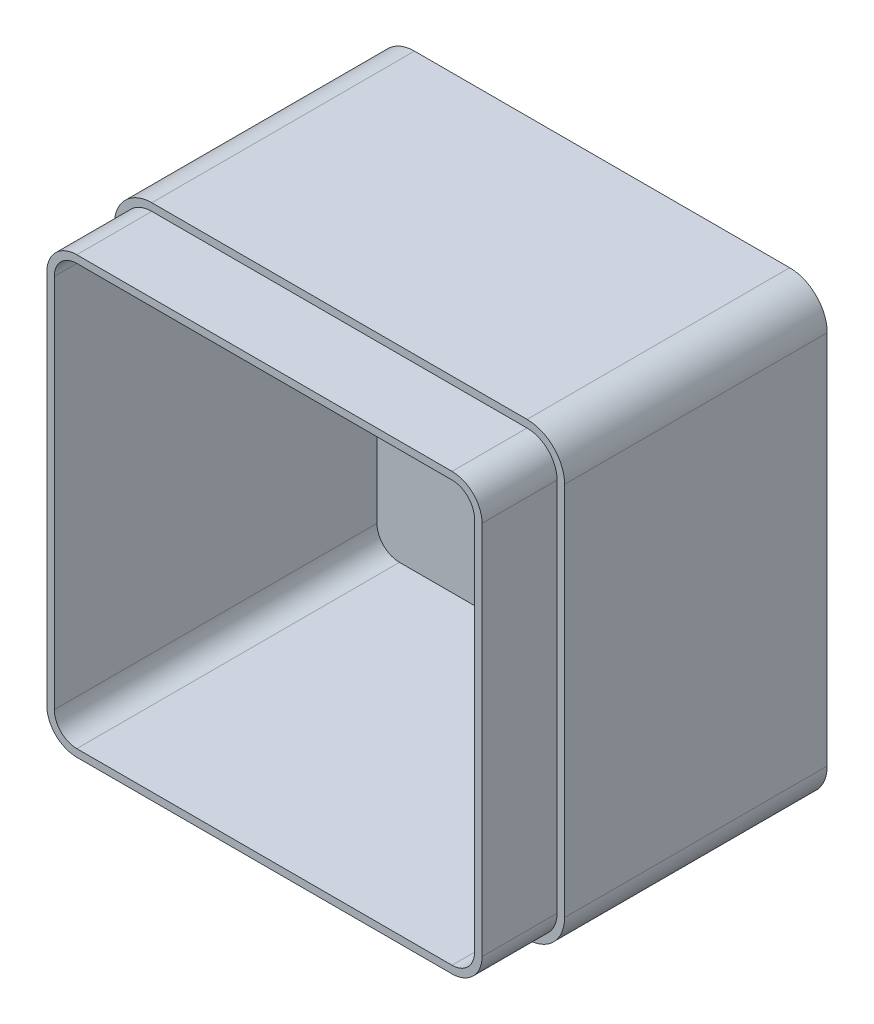
ISO-10303-21;
HEADER;
FILE_DESCRIPTION(('STEP AP214'),'2;1');
FILE_NAME('part.step','',(''),(''),'','','');
FILE_SCHEMA(('AUTOMOTIVE_DESIGN { 1 0 10303 214 1 1 1 1 }'));
ENDSEC;
DATA;
#1=APPLICATION_CONTEXT('core data for automotive mechanical design processes');
#2=APPLICATION_PROTOCOL_DEFINITION('international standard','automotive_design',2000,#1);
#3=PRODUCT_CONTEXT('',#1,'mechanical');
#4=PRODUCT('Part','Part','',(#3));
#5=PRODUCT_RELATED_PRODUCT_CATEGORY('part','',(#4));
#6=PRODUCT_DEFINITION_FORMATION('','',#4);
#7=PRODUCT_DEFINITION_CONTEXT('part definition',#1,'design');
#8=PRODUCT_DEFINITION('design','',#6,#7);
#9=PRODUCT_DEFINITION_SHAPE('','',#8);
#10=(LENGTH_UNIT() NAMED_UNIT(*) SI_UNIT(.MILLI.,.METRE.));
#11=(NAMED_UNIT(*) PLANE_ANGLE_UNIT() SI_UNIT($,.RADIAN.));
#12=(NAMED_UNIT(*) SI_UNIT($,.STERADIAN.) SOLID_ANGLE_UNIT());
#13=UNCERTAINTY_MEASURE_WITH_UNIT(LENGTH_MEASURE(1.E-05),#10,'distance_accuracy_value','');
#14=(GEOMETRIC_REPRESENTATION_CONTEXT(3) GLOBAL_UNCERTAINTY_ASSIGNED_CONTEXT((#13)) GLOBAL_UNIT_ASSIGNED_CONTEXT((#10,
#11,#12)) REPRESENTATION_CONTEXT('',''));
#15=CARTESIAN_POINT('',(0.,0.,0.));
#16=DIRECTION('',(0.,0.,1.));
#17=DIRECTION('',(1.,0.,0.));
#18=AXIS2_PLACEMENT_3D('',#15,#16,#17);
#19=CARTESIAN_POINT('',(0.,0.,90.));
#20=DIRECTION('',(0.,0.,-1.));
#21=DIRECTION('',(-1.,0.,0.));
#22=AXIS2_PLACEMENT_3D('',#19,#20,#21);
#23=PLANE('',#22);
#24=DIRECTION('',(1.,0.,0.));
#25=VECTOR('',#24,1.);
#26=CARTESIAN_POINT('',(0.,4.,90.));
#27=LINE('',#26,#25);
#28=CARTESIAN_POINT('',(9.99999999999999,4.,90.));
#29=VERTEX_POINT('',#28);
#30=CARTESIAN_POINT('',(110.,4.,90.));
#31=VERTEX_POINT('',#30);
#32=EDGE_CURVE('E384',#29,#31,#27,.T.);
#33=ORIENTED_EDGE('',*,*,#32,.F.);
#34=CARTESIAN_POINT('',(9.99999999999999,10.,90.));
#35=DIRECTION('',(0.,0.,-1.));
#36=DIRECTION('',(-1.,0.,0.));
#37=AXIS2_PLACEMENT_3D('',#34,#35,#36);
#38=CIRCLE('',#37,6.);
#39=CARTESIAN_POINT('',(4.,10.,90.));
#40=VERTEX_POINT('',#39);
#41=EDGE_CURVE('E385',#40,#29,#38,.F.);
#42=ORIENTED_EDGE('',*,*,#41,.F.);
#43=DIRECTION('',(0.,-1.,0.));
#44=VECTOR('',#43,1.);
#45=CARTESIAN_POINT('',(4.,0.,90.));
#46=LINE('',#45,#44);
#47=CARTESIAN_POINT('',(3.99999999999996,110.,90.));
#48=VERTEX_POINT('',#47);
#49=EDGE_CURVE('E358',#48,#40,#46,.T.);
#50=ORIENTED_EDGE('',*,*,#49,.F.);
#51=CARTESIAN_POINT('',(9.99999999999996,110.,90.));
#52=DIRECTION('',(0.,0.,-1.));
#53=DIRECTION('',(-1.,0.,0.));
#54=AXIS2_PLACEMENT_3D('',#51,#52,#53);
#55=CIRCLE('',#54,6.);
#56=CARTESIAN_POINT('',(9.99999999999996,116.,90.));
#57=VERTEX_POINT('',#56);
#58=EDGE_CURVE('E364',#57,#48,#55,.F.);
#59=ORIENTED_EDGE('',*,*,#58,.F.);
#60=DIRECTION('',(-1.,0.,0.));
#61=VECTOR('',#60,1.);
#62=CARTESIAN_POINT('',(0.,116.,90.));
#63=LINE('',#62,#61);
#64=CARTESIAN_POINT('',(110.,116.,90.));
#65=VERTEX_POINT('',#64);
#66=EDGE_CURVE('E374',#65,#57,#63,.T.);
#67=ORIENTED_EDGE('',*,*,#66,.F.);
#68=CARTESIAN_POINT('',(110.,110.,90.));
#69=DIRECTION('',(0.,0.,-1.));
#70=DIRECTION('',(-1.,0.,0.));
#71=AXIS2_PLACEMENT_3D('',#68,#69,#70);
#72=CIRCLE('',#71,6.);
#73=CARTESIAN_POINT('',(116.,110.,90.));
#74=VERTEX_POINT('',#73);
#75=EDGE_CURVE('E388',#74,#65,#72,.F.);
#76=ORIENTED_EDGE('',*,*,#75,.F.);
#77=DIRECTION('',(0.,1.,0.));
#78=VECTOR('',#77,1.);
#79=CARTESIAN_POINT('',(116.,0.,90.));
#80=LINE('',#79,#78);
#81=CARTESIAN_POINT('',(116.,10.,90.));
#82=VERTEX_POINT('',#81);
#83=EDGE_CURVE('E392',#82,#74,#80,.T.);
#84=ORIENTED_EDGE('',*,*,#83,.F.);
#85=CARTESIAN_POINT('',(110.,10.,90.));
#86=DIRECTION('',(0.,0.,-1.));
#87=DIRECTION('',(-1.,0.,0.));
#88=AXIS2_PLACEMENT_3D('',#85,#86,#87);
#89=CIRCLE('',#88,6.);
#90=EDGE_CURVE('E334',#31,#82,#89,.F.);
#91=ORIENTED_EDGE('',*,*,#90,.F.);
#92=EDGE_LOOP('',(#33,#42,#50,#59,#67,#76,#84,#91));
#93=FACE_BOUND('',#92,.T.);
#94=CARTESIAN_POINT('',(9.99999999999999,10.,90.));
#95=DIRECTION('',(0.,0.,1.));
#96=DIRECTION('',(1.,0.,0.));
#97=AXIS2_PLACEMENT_3D('',#94,#95,#96);
#98=CIRCLE('',#97,8.);
#99=CARTESIAN_POINT('',(2.,9.99999999999999,90.));
#100=VERTEX_POINT('',#99);
#101=CARTESIAN_POINT('',(9.99999999999999,2.,90.));
#102=VERTEX_POINT('',#101);
#103=EDGE_CURVE('E256',#100,#102,#98,.T.);
#104=ORIENTED_EDGE('',*,*,#103,.T.);
#105=DIRECTION('',(1.,0.,0.));
#106=VECTOR('',#105,1.);
#107=CARTESIAN_POINT('',(9.99999999999999,2.,90.));
#108=LINE('',#107,#106);
#109=CARTESIAN_POINT('',(110.,2.,90.));
#110=VERTEX_POINT('',#109);
#111=EDGE_CURVE('E206',#102,#110,#108,.T.);
#112=ORIENTED_EDGE('',*,*,#111,.T.);
#113=CARTESIAN_POINT('',(110.,10.,90.));
#114=DIRECTION('',(0.,0.,1.));
#115=DIRECTION('',(1.,0.,0.));
#116=AXIS2_PLACEMENT_3D('',#113,#114,#115);
#117=CIRCLE('',#116,7.99999999999999);
#118=CARTESIAN_POINT('',(118.,10.,90.));
#119=VERTEX_POINT('',#118);
#120=EDGE_CURVE('E55',#110,#119,#117,.T.);
#121=ORIENTED_EDGE('',*,*,#120,.T.);
#122=DIRECTION('',(0.,1.,0.));
#123=VECTOR('',#122,1.);
#124=CARTESIAN_POINT('',(118.,10.,90.));
#125=LINE('',#124,#123);
#126=CARTESIAN_POINT('',(118.,110.,90.));
#127=VERTEX_POINT('',#126);
#128=EDGE_CURVE('E263',#119,#127,#125,.T.);
#129=ORIENTED_EDGE('',*,*,#128,.T.);
#130=CARTESIAN_POINT('',(110.,110.,90.));
#131=DIRECTION('',(0.,0.,1.));
#132=DIRECTION('',(1.,0.,0.));
#133=AXIS2_PLACEMENT_3D('',#130,#131,#132);
#134=CIRCLE('',#133,7.99999999999999);
#135=CARTESIAN_POINT('',(110.,118.,90.));
#136=VERTEX_POINT('',#135);
#137=EDGE_CURVE('E267',#127,#136,#134,.T.);
#138=ORIENTED_EDGE('',*,*,#137,.T.);
#139=DIRECTION('',(-1.,0.,0.));
#140=VECTOR('',#139,1.);
#141=CARTESIAN_POINT('',(110.,118.,90.));
#142=LINE('',#141,#140);
#143=CARTESIAN_POINT('',(9.99999999999995,118.,90.));
#144=VERTEX_POINT('',#143);
#145=EDGE_CURVE('E271',#136,#144,#142,.T.);
#146=ORIENTED_EDGE('',*,*,#145,.T.);
#147=CARTESIAN_POINT('',(9.99999999999996,110.,90.));
#148=DIRECTION('',(0.,0.,1.));
#149=DIRECTION('',(1.,0.,0.));
#150=AXIS2_PLACEMENT_3D('',#147,#148,#149);
#151=CIRCLE('',#150,7.99999999999999);
#152=CARTESIAN_POINT('',(1.99999999999997,110.,90.));
#153=VERTEX_POINT('',#152);
#154=EDGE_CURVE('E233',#144,#153,#151,.T.);
#155=ORIENTED_EDGE('',*,*,#154,.T.);
#156=DIRECTION('',(0.,-1.,0.));
#157=VECTOR('',#156,1.);
#158=CARTESIAN_POINT('',(1.99999999999996,110.,90.));
#159=LINE('',#158,#157);
#160=EDGE_CURVE('E229',#153,#100,#159,.T.);
#161=ORIENTED_EDGE('',*,*,#160,.T.);
#162=EDGE_LOOP('',(#104,#112,#121,#129,#138,#146,#155,#161));
#163=FACE_BOUND('',#162,.T.);
#164=ADVANCED_FACE('F39',(#93,#163),#23,.F.);
#165=CARTESIAN_POINT('',(4.,0.,90.));
#166=DIRECTION('',(1.,0.,0.));
#167=DIRECTION('',(0.,1.,0.));
#168=AXIS2_PLACEMENT_3D('',#165,#166,#167);
#169=PLANE('',#168);
#170=DIRECTION('',(0.,-1.,0.));
#171=VECTOR('',#170,1.);
#172=CARTESIAN_POINT('',(4.,0.,4.));
#173=LINE('',#172,#171);
#174=CARTESIAN_POINT('',(3.99999999999996,110.,4.));
#175=VERTEX_POINT('',#174);
#176=CARTESIAN_POINT('',(4.,10.,4.));
#177=VERTEX_POINT('',#176);
#178=EDGE_CURVE('E320',#175,#177,#173,.T.);
#179=ORIENTED_EDGE('',*,*,#178,.F.);
#180=DIRECTION('',(0.,0.,1.));
#181=VECTOR('',#180,1.);
#182=CARTESIAN_POINT('',(3.99999999999996,110.,90.));
#183=LINE('',#182,#181);
#184=EDGE_CURVE('E330',#48,#175,#183,.F.);
#185=ORIENTED_EDGE('',*,*,#184,.F.);
#186=ORIENTED_EDGE('',*,*,#49,.T.);
#187=DIRECTION('',(0.,0.,1.));
#188=VECTOR('',#187,1.);
#189=CARTESIAN_POINT('',(4.,10.,90.));
#190=LINE('',#189,#188);
#191=EDGE_CURVE('E325',#177,#40,#190,.T.);
#192=ORIENTED_EDGE('',*,*,#191,.F.);
#193=EDGE_LOOP('',(#179,#185,#186,#192));
#194=FACE_BOUND('',#193,.T.);
#195=ADVANCED_FACE('F504',(#194),#169,.T.);
#196=CARTESIAN_POINT('',(0.,4.,90.));
#197=DIRECTION('',(0.,1.,0.));
#198=DIRECTION('',(0.,0.,1.));
#199=AXIS2_PLACEMENT_3D('',#196,#197,#198);
#200=PLANE('',#199);
#201=DIRECTION('',(1.,0.,0.));
#202=VECTOR('',#201,1.);
#203=CARTESIAN_POINT('',(0.,4.,4.));
#204=LINE('',#203,#202);
#205=CARTESIAN_POINT('',(9.99999999999999,4.,4.));
#206=VERTEX_POINT('',#205);
#207=CARTESIAN_POINT('',(110.,4.,4.));
#208=VERTEX_POINT('',#207);
#209=EDGE_CURVE('E324',#206,#208,#204,.T.);
#210=ORIENTED_EDGE('',*,*,#209,.F.);
#211=DIRECTION('',(0.,0.,1.));
#212=VECTOR('',#211,1.);
#213=CARTESIAN_POINT('',(9.99999999999999,4.,90.));
#214=LINE('',#213,#212);
#215=EDGE_CURVE('E343',#29,#206,#214,.F.);
#216=ORIENTED_EDGE('',*,*,#215,.F.);
#217=ORIENTED_EDGE('',*,*,#32,.T.);
#218=DIRECTION('',(0.,0.,1.));
#219=VECTOR('',#218,1.);
#220=CARTESIAN_POINT('',(110.,4.,90.));
#221=LINE('',#220,#219);
#222=EDGE_CURVE('E361',#208,#31,#221,.T.);
#223=ORIENTED_EDGE('',*,*,#222,.F.);
#224=EDGE_LOOP('',(#210,#216,#217,#223));
#225=FACE_BOUND('',#224,.T.);
#226=ADVANCED_FACE('F509',(#225),#200,.T.);
#227=CARTESIAN_POINT('',(116.,0.,90.));
#228=DIRECTION('',(-1.,0.,0.));
#229=DIRECTION('',(0.,-1.,0.));
#230=AXIS2_PLACEMENT_3D('',#227,#228,#229);
#231=PLANE('',#230);
#232=ORIENTED_EDGE('',*,*,#83,.T.);
#233=DIRECTION('',(0.,0.,1.));
#234=VECTOR('',#233,1.);
#235=CARTESIAN_POINT('',(116.,110.,90.));
#236=LINE('',#235,#234);
#237=CARTESIAN_POINT('',(116.,110.,4.));
#238=VERTEX_POINT('',#237);
#239=EDGE_CURVE('E371',#238,#74,#236,.T.);
#240=ORIENTED_EDGE('',*,*,#239,.F.);
#241=DIRECTION('',(0.,1.,0.));
#242=VECTOR('',#241,1.);
#243=CARTESIAN_POINT('',(116.,0.,4.));
#244=LINE('',#243,#242);
#245=CARTESIAN_POINT('',(116.,10.,4.));
#246=VERTEX_POINT('',#245);
#247=EDGE_CURVE('E335',#246,#238,#244,.T.);
#248=ORIENTED_EDGE('',*,*,#247,.F.);
#249=DIRECTION('',(0.,0.,1.));
#250=VECTOR('',#249,1.);
#251=CARTESIAN_POINT('',(116.,10.,90.));
#252=LINE('',#251,#250);
#253=EDGE_CURVE('E354',#82,#246,#252,.F.);
#254=ORIENTED_EDGE('',*,*,#253,.F.);
#255=EDGE_LOOP('',(#232,#240,#248,#254));
#256=FACE_BOUND('',#255,.T.);
#257=ADVANCED_FACE('F538',(#256),#231,.T.);
#258=CARTESIAN_POINT('',(0.,116.,90.));
#259=DIRECTION('',(0.,-1.,0.));
#260=DIRECTION('',(0.,0.,-1.));
#261=AXIS2_PLACEMENT_3D('',#258,#259,#260);
#262=PLANE('',#261);
#263=ORIENTED_EDGE('',*,*,#66,.T.);
#264=DIRECTION('',(0.,0.,-1.));
#265=VECTOR('',#264,1.);
#266=CARTESIAN_POINT('',(9.99999999999996,116.,90.));
#267=LINE('',#266,#265);
#268=CARTESIAN_POINT('',(9.99999999999996,116.,4.));
#269=VERTEX_POINT('',#268);
#270=EDGE_CURVE('E329',#269,#57,#267,.F.);
#271=ORIENTED_EDGE('',*,*,#270,.F.);
#272=DIRECTION('',(-1.,0.,0.));
#273=VECTOR('',#272,1.);
#274=CARTESIAN_POINT('',(0.,116.,4.));
#275=LINE('',#274,#273);
#276=CARTESIAN_POINT('',(110.,116.,4.));
#277=VERTEX_POINT('',#276);
#278=EDGE_CURVE('E339',#277,#269,#275,.T.);
#279=ORIENTED_EDGE('',*,*,#278,.F.);
#280=DIRECTION('',(0.,0.,-1.));
#281=VECTOR('',#280,1.);
#282=CARTESIAN_POINT('',(110.,116.,90.));
#283=LINE('',#282,#281);
#284=EDGE_CURVE('E375',#65,#277,#283,.T.);
#285=ORIENTED_EDGE('',*,*,#284,.F.);
#286=EDGE_LOOP('',(#263,#271,#279,#285));
#287=FACE_BOUND('',#286,.T.);
#288=ADVANCED_FACE('F534',(#287),#262,.T.);
#289=CARTESIAN_POINT('',(0.,0.,4.));
#290=DIRECTION('',(0.,0.,-1.));
#291=DIRECTION('',(-1.,0.,0.));
#292=AXIS2_PLACEMENT_3D('',#289,#290,#291);
#293=PLANE('',#292);
#294=ORIENTED_EDGE('',*,*,#247,.T.);
#295=CARTESIAN_POINT('',(110.,110.,4.));
#296=DIRECTION('',(0.,0.,-1.));
#297=DIRECTION('',(-1.,0.,0.));
#298=AXIS2_PLACEMENT_3D('',#295,#296,#297);
#299=CIRCLE('',#298,6.);
#300=EDGE_CURVE('E350',#277,#238,#299,.T.);
#301=ORIENTED_EDGE('',*,*,#300,.F.);
#302=ORIENTED_EDGE('',*,*,#278,.T.);
#303=CARTESIAN_POINT('',(9.99999999999996,110.,4.));
#304=DIRECTION('',(0.,0.,-1.));
#305=DIRECTION('',(-1.,0.,0.));
#306=AXIS2_PLACEMENT_3D('',#303,#304,#305);
#307=CIRCLE('',#306,6.);
#308=EDGE_CURVE('E351',#175,#269,#307,.T.);
#309=ORIENTED_EDGE('',*,*,#308,.F.);
#310=ORIENTED_EDGE('',*,*,#178,.T.);
#311=CARTESIAN_POINT('',(9.99999999999999,10.,4.));
#312=DIRECTION('',(0.,0.,-1.));
#313=DIRECTION('',(-1.,0.,0.));
#314=AXIS2_PLACEMENT_3D('',#311,#312,#313);
#315=CIRCLE('',#314,6.);
#316=EDGE_CURVE('E344',#206,#177,#315,.T.);
#317=ORIENTED_EDGE('',*,*,#316,.F.);
#318=ORIENTED_EDGE('',*,*,#209,.T.);
#319=CARTESIAN_POINT('',(110.,10.,4.));
#320=DIRECTION('',(0.,0.,-1.));
#321=DIRECTION('',(-1.,0.,0.));
#322=AXIS2_PLACEMENT_3D('',#319,#320,#321);
#323=CIRCLE('',#322,6.);
#324=EDGE_CURVE('E340',#246,#208,#323,.T.);
#325=ORIENTED_EDGE('',*,*,#324,.F.);
#326=EDGE_LOOP('',(#294,#301,#302,#309,#310,#317,#318,#325));
#327=FACE_BOUND('',#326,.T.);
#328=ADVANCED_FACE('F530',(#327),#293,.F.);
#329=CARTESIAN_POINT('',(110.,10.,90.));
#330=DIRECTION('',(0.,0.,-1.));
#331=DIRECTION('',(-1.,0.,0.));
#332=AXIS2_PLACEMENT_3D('',#329,#330,#331);
#333=CYLINDRICAL_SURFACE('',#332,6.);
#334=ORIENTED_EDGE('',*,*,#90,.T.);
#335=ORIENTED_EDGE('',*,*,#253,.T.);
#336=ORIENTED_EDGE('',*,*,#324,.T.);
#337=ORIENTED_EDGE('',*,*,#222,.T.);
#338=EDGE_LOOP('',(#334,#335,#336,#337));
#339=FACE_BOUND('',#338,.T.);
#340=ADVANCED_FACE('F526',(#339),#333,.F.);
#341=CARTESIAN_POINT('',(9.99999999999999,10.,90.));
#342=DIRECTION('',(0.,0.,-1.));
#343=DIRECTION('',(-1.,0.,0.));
#344=AXIS2_PLACEMENT_3D('',#341,#342,#343);
#345=CYLINDRICAL_SURFACE('',#344,6.);
#346=ORIENTED_EDGE('',*,*,#41,.T.);
#347=ORIENTED_EDGE('',*,*,#215,.T.);
#348=ORIENTED_EDGE('',*,*,#316,.T.);
#349=ORIENTED_EDGE('',*,*,#191,.T.);
#350=EDGE_LOOP('',(#346,#347,#348,#349));
#351=FACE_BOUND('',#350,.T.);
#352=ADVANCED_FACE('F522',(#351),#345,.F.);
#353=CARTESIAN_POINT('',(110.,110.,90.));
#354=DIRECTION('',(0.,0.,-1.));
#355=DIRECTION('',(-1.,0.,0.));
#356=AXIS2_PLACEMENT_3D('',#353,#354,#355);
#357=CYLINDRICAL_SURFACE('',#356,6.);
#358=ORIENTED_EDGE('',*,*,#75,.T.);
#359=ORIENTED_EDGE('',*,*,#284,.T.);
#360=ORIENTED_EDGE('',*,*,#300,.T.);
#361=ORIENTED_EDGE('',*,*,#239,.T.);
#362=EDGE_LOOP('',(#358,#359,#360,#361));
#363=FACE_BOUND('',#362,.T.);
#364=ADVANCED_FACE('F518',(#363),#357,.F.);
#365=CARTESIAN_POINT('',(9.99999999999996,110.,90.));
#366=DIRECTION('',(0.,0.,-1.));
#367=DIRECTION('',(-1.,0.,0.));
#368=AXIS2_PLACEMENT_3D('',#365,#366,#367);
#369=CYLINDRICAL_SURFACE('',#368,6.);
#370=ORIENTED_EDGE('',*,*,#58,.T.);
#371=ORIENTED_EDGE('',*,*,#184,.T.);
#372=ORIENTED_EDGE('',*,*,#308,.T.);
#373=ORIENTED_EDGE('',*,*,#270,.T.);
#374=EDGE_LOOP('',(#370,#371,#372,#373));
#375=FACE_BOUND('',#374,.T.);
#376=ADVANCED_FACE('F515',(#375),#369,.F.);
#377=CARTESIAN_POINT('',(9.99999999999999,10.,70.));
#378=DIRECTION('',(0.,0.,1.));
#379=DIRECTION('',(1.,0.,0.));
#380=AXIS2_PLACEMENT_3D('',#377,#378,#379);
#381=PLANE('',#380);
#382=DIRECTION('',(0.,-1.,0.));
#383=VECTOR('',#382,1.);
#384=CARTESIAN_POINT('',(1.99999999999996,110.,70.));
#385=LINE('',#384,#383);
#386=CARTESIAN_POINT('',(1.99999999999997,110.,70.));
#387=VERTEX_POINT('',#386);
#388=CARTESIAN_POINT('',(2.,9.99999999999999,70.));
#389=VERTEX_POINT('',#388);
#390=EDGE_CURVE('E213',#387,#389,#385,.T.);
#391=ORIENTED_EDGE('',*,*,#390,.F.);
#392=CARTESIAN_POINT('',(9.99999999999996,110.,70.));
#393=DIRECTION('',(0.,0.,1.));
#394=DIRECTION('',(1.,0.,0.));
#395=AXIS2_PLACEMENT_3D('',#392,#393,#394);
#396=CIRCLE('',#395,7.99999999999999);
#397=CARTESIAN_POINT('',(9.99999999999995,118.,70.));
#398=VERTEX_POINT('',#397);
#399=EDGE_CURVE('E250',#398,#387,#396,.T.);
#400=ORIENTED_EDGE('',*,*,#399,.F.);
#401=DIRECTION('',(-1.,0.,0.));
#402=VECTOR('',#401,1.);
#403=CARTESIAN_POINT('',(110.,118.,70.));
#404=LINE('',#403,#402);
#405=CARTESIAN_POINT('',(110.,118.,70.));
#406=VERTEX_POINT('',#405);
#407=EDGE_CURVE('E246',#406,#398,#404,.T.);
#408=ORIENTED_EDGE('',*,*,#407,.F.);
#409=CARTESIAN_POINT('',(110.,110.,70.));
#410=DIRECTION('',(0.,0.,1.));
#411=DIRECTION('',(1.,0.,0.));
#412=AXIS2_PLACEMENT_3D('',#409,#410,#411);
#413=CIRCLE('',#412,7.99999999999999);
#414=CARTESIAN_POINT('',(118.,110.,70.));
#415=VERTEX_POINT('',#414);
#416=EDGE_CURVE('E242',#415,#406,#413,.T.);
#417=ORIENTED_EDGE('',*,*,#416,.F.);
#418=DIRECTION('',(0.,1.,0.));
#419=VECTOR('',#418,1.);
#420=CARTESIAN_POINT('',(118.,10.,70.));
#421=LINE('',#420,#419);
#422=CARTESIAN_POINT('',(118.,10.,70.));
#423=VERTEX_POINT('',#422);
#424=EDGE_CURVE('E238',#423,#415,#421,.T.);
#425=ORIENTED_EDGE('',*,*,#424,.F.);
#426=CARTESIAN_POINT('',(110.,10.,70.));
#427=DIRECTION('',(0.,0.,1.));
#428=DIRECTION('',(1.,0.,0.));
#429=AXIS2_PLACEMENT_3D('',#426,#427,#428);
#430=CIRCLE('',#429,7.99999999999999);
#431=CARTESIAN_POINT('',(110.,2.,70.));
#432=VERTEX_POINT('',#431);
#433=EDGE_CURVE('E223',#432,#423,#430,.T.);
#434=ORIENTED_EDGE('',*,*,#433,.F.);
#435=DIRECTION('',(1.,0.,0.));
#436=VECTOR('',#435,1.);
#437=CARTESIAN_POINT('',(9.99999999999999,2.,70.));
#438=LINE('',#437,#436);
#439=CARTESIAN_POINT('',(9.99999999999999,2.,70.));
#440=VERTEX_POINT('',#439);
#441=EDGE_CURVE('E204',#440,#432,#438,.T.);
#442=ORIENTED_EDGE('',*,*,#441,.F.);
#443=CARTESIAN_POINT('',(9.99999999999999,10.,70.));
#444=DIRECTION('',(0.,0.,1.));
#445=DIRECTION('',(1.,0.,0.));
#446=AXIS2_PLACEMENT_3D('',#443,#444,#445);
#447=CIRCLE('',#446,8.);
#448=EDGE_CURVE('E219',#389,#440,#447,.T.);
#449=ORIENTED_EDGE('',*,*,#448,.F.);
#450=EDGE_LOOP('',(#391,#400,#408,#417,#425,#434,#442,#449));
#451=FACE_BOUND('',#450,.T.);
#452=CARTESIAN_POINT('',(9.99999999999999,10.,70.));
#453=DIRECTION('',(0.,0.,1.));
#454=DIRECTION('',(1.,0.,0.));
#455=AXIS2_PLACEMENT_3D('',#452,#453,#454);
#456=CIRCLE('',#455,10.);
#457=CARTESIAN_POINT('',(0.,9.99999999999999,70.));
#458=VERTEX_POINT('',#457);
#459=CARTESIAN_POINT('',(9.99999999999999,0.,70.));
#460=VERTEX_POINT('',#459);
#461=EDGE_CURVE('E280',#458,#460,#456,.T.);
#462=ORIENTED_EDGE('',*,*,#461,.T.);
#463=DIRECTION('',(1.,0.,0.));
#464=VECTOR('',#463,1.);
#465=CARTESIAN_POINT('',(9.99999999999999,0.,70.));
#466=LINE('',#465,#464);
#467=CARTESIAN_POINT('',(110.,0.,70.));
#468=VERTEX_POINT('',#467);
#469=EDGE_CURVE('E300',#460,#468,#466,.T.);
#470=ORIENTED_EDGE('',*,*,#469,.T.);
#471=CARTESIAN_POINT('',(110.,10.,70.));
#472=DIRECTION('',(0.,0.,1.));
#473=DIRECTION('',(1.,0.,0.));
#474=AXIS2_PLACEMENT_3D('',#471,#472,#473);
#475=CIRCLE('',#474,9.99999999999999);
#476=CARTESIAN_POINT('',(120.,10.,70.));
#477=VERTEX_POINT('',#476);
#478=EDGE_CURVE('E303',#468,#477,#475,.T.);
#479=ORIENTED_EDGE('',*,*,#478,.T.);
#480=DIRECTION('',(0.,1.,0.));
#481=VECTOR('',#480,1.);
#482=CARTESIAN_POINT('',(120.,10.,70.));
#483=LINE('',#482,#481);
#484=CARTESIAN_POINT('',(120.,110.,70.));
#485=VERTEX_POINT('',#484);
#486=EDGE_CURVE('E306',#477,#485,#483,.T.);
#487=ORIENTED_EDGE('',*,*,#486,.T.);
#488=CARTESIAN_POINT('',(110.,110.,70.));
#489=DIRECTION('',(0.,0.,1.));
#490=DIRECTION('',(1.,0.,0.));
#491=AXIS2_PLACEMENT_3D('',#488,#489,#490);
#492=CIRCLE('',#491,9.99999999999999);
#493=CARTESIAN_POINT('',(110.,120.,70.));
#494=VERTEX_POINT('',#493);
#495=EDGE_CURVE('E309',#485,#494,#492,.T.);
#496=ORIENTED_EDGE('',*,*,#495,.T.);
#497=DIRECTION('',(-1.,0.,0.));
#498=VECTOR('',#497,1.);
#499=CARTESIAN_POINT('',(110.,120.,70.));
#500=LINE('',#499,#498);
#501=CARTESIAN_POINT('',(9.99999999999996,120.,70.));
#502=VERTEX_POINT('',#501);
#503=EDGE_CURVE('E63',#494,#502,#500,.T.);
#504=ORIENTED_EDGE('',*,*,#503,.T.);
#505=CARTESIAN_POINT('',(9.99999999999996,110.,70.));
#506=DIRECTION('',(0.,0.,1.));
#507=DIRECTION('',(1.,0.,0.));
#508=AXIS2_PLACEMENT_3D('',#505,#506,#507);
#509=CIRCLE('',#508,9.99999999999999);
#510=CARTESIAN_POINT('',(0.,110.,70.));
#511=VERTEX_POINT('',#510);
#512=EDGE_CURVE('E314',#502,#511,#509,.T.);
#513=ORIENTED_EDGE('',*,*,#512,.T.);
#514=DIRECTION('',(0.,-1.,0.));
#515=VECTOR('',#514,1.);
#516=CARTESIAN_POINT('',(0.,110.,70.));
#517=LINE('',#516,#515);
#518=EDGE_CURVE('E317',#511,#458,#517,.T.);
#519=ORIENTED_EDGE('',*,*,#518,.T.);
#520=EDGE_LOOP('',(#462,#470,#479,#487,#496,#504,#513,#519));
#521=FACE_BOUND('',#520,.T.);
#522=ADVANCED_FACE('F218',(#451,#521),#381,.T.);
#523=CARTESIAN_POINT('',(9.99999999999999,10.,70.));
#524=DIRECTION('',(0.,0.,1.));
#525=DIRECTION('',(1.,0.,0.));
#526=AXIS2_PLACEMENT_3D('',#523,#524,#525);
#527=CYLINDRICAL_SURFACE('',#526,8.);
#528=ORIENTED_EDGE('',*,*,#103,.F.);
#529=DIRECTION('',(0.,0.,1.));
#530=VECTOR('',#529,1.);
#531=CARTESIAN_POINT('',(2.,9.99999999999999,70.));
#532=LINE('',#531,#530);
#533=EDGE_CURVE('E227',#389,#100,#532,.T.);
#534=ORIENTED_EDGE('',*,*,#533,.F.);
#535=ORIENTED_EDGE('',*,*,#448,.T.);
#536=DIRECTION('',(0.,0.,1.));
#537=VECTOR('',#536,1.);
#538=CARTESIAN_POINT('',(9.99999999999999,2.,70.));
#539=LINE('',#538,#537);
#540=EDGE_CURVE('E201',#440,#102,#539,.T.);
#541=ORIENTED_EDGE('',*,*,#540,.T.);
#542=EDGE_LOOP('',(#528,#534,#535,#541));
#543=FACE_BOUND('',#542,.T.);
#544=ADVANCED_FACE('F226',(#543),#527,.T.);
#545=CARTESIAN_POINT('',(1.99999999999996,110.,70.));
#546=DIRECTION('',(-1.,0.,0.));
#547=DIRECTION('',(0.,-1.,0.));
#548=AXIS2_PLACEMENT_3D('',#545,#546,#547);
#549=PLANE('',#548);
#550=ORIENTED_EDGE('',*,*,#160,.F.);
#551=DIRECTION('',(0.,0.,1.));
#552=VECTOR('',#551,1.);
#553=CARTESIAN_POINT('',(1.99999999999997,110.,70.));
#554=LINE('',#553,#552);
#555=EDGE_CURVE('E281',#387,#153,#554,.T.);
#556=ORIENTED_EDGE('',*,*,#555,.F.);
#557=ORIENTED_EDGE('',*,*,#390,.T.);
#558=ORIENTED_EDGE('',*,*,#533,.T.);
#559=EDGE_LOOP('',(#550,#556,#557,#558));
#560=FACE_BOUND('',#559,.T.);
#561=ADVANCED_FACE('F549',(#560),#549,.T.);
#562=CARTESIAN_POINT('',(9.99999999999996,110.,70.));
#563=DIRECTION('',(0.,0.,1.));
#564=DIRECTION('',(1.,0.,0.));
#565=AXIS2_PLACEMENT_3D('',#562,#563,#564);
#566=CYLINDRICAL_SURFACE('',#565,7.99999999999999);
#567=ORIENTED_EDGE('',*,*,#154,.F.);
#568=DIRECTION('',(0.,0.,1.));
#569=VECTOR('',#568,1.);
#570=CARTESIAN_POINT('',(9.99999999999995,118.,70.));
#571=LINE('',#570,#569);
#572=EDGE_CURVE('E284',#398,#144,#571,.T.);
#573=ORIENTED_EDGE('',*,*,#572,.F.);
#574=ORIENTED_EDGE('',*,*,#399,.T.);
#575=ORIENTED_EDGE('',*,*,#555,.T.);
#576=EDGE_LOOP('',(#567,#573,#574,#575));
#577=FACE_BOUND('',#576,.T.);
#578=ADVANCED_FACE('F564',(#577),#566,.T.);
#579=CARTESIAN_POINT('',(110.,118.,70.));
#580=DIRECTION('',(0.,1.,0.));
#581=DIRECTION('',(0.,0.,1.));
#582=AXIS2_PLACEMENT_3D('',#579,#580,#581);
#583=PLANE('',#582);
#584=ORIENTED_EDGE('',*,*,#145,.F.);
#585=DIRECTION('',(0.,0.,1.));
#586=VECTOR('',#585,1.);
#587=CARTESIAN_POINT('',(110.,118.,70.));
#588=LINE('',#587,#586);
#589=EDGE_CURVE('E287',#406,#136,#588,.T.);
#590=ORIENTED_EDGE('',*,*,#589,.F.);
#591=ORIENTED_EDGE('',*,*,#407,.T.);
#592=ORIENTED_EDGE('',*,*,#572,.T.);
#593=EDGE_LOOP('',(#584,#590,#591,#592));
#594=FACE_BOUND('',#593,.T.);
#595=ADVANCED_FACE('F560',(#594),#583,.T.);
#596=CARTESIAN_POINT('',(110.,110.,70.));
#597=DIRECTION('',(0.,0.,1.));
#598=DIRECTION('',(1.,0.,0.));
#599=AXIS2_PLACEMENT_3D('',#596,#597,#598);
#600=CYLINDRICAL_SURFACE('',#599,7.99999999999999);
#601=ORIENTED_EDGE('',*,*,#137,.F.);
#602=DIRECTION('',(0.,0.,1.));
#603=VECTOR('',#602,1.);
#604=CARTESIAN_POINT('',(118.,110.,70.));
#605=LINE('',#604,#603);
#606=EDGE_CURVE('E290',#415,#127,#605,.T.);
#607=ORIENTED_EDGE('',*,*,#606,.F.);
#608=ORIENTED_EDGE('',*,*,#416,.T.);
#609=ORIENTED_EDGE('',*,*,#589,.T.);
#610=EDGE_LOOP('',(#601,#607,#608,#609));
#611=FACE_BOUND('',#610,.T.);
#612=ADVANCED_FACE('F556',(#611),#600,.T.);
#613=CARTESIAN_POINT('',(118.,10.,70.));
#614=DIRECTION('',(1.,0.,0.));
#615=DIRECTION('',(0.,1.,0.));
#616=AXIS2_PLACEMENT_3D('',#613,#614,#615);
#617=PLANE('',#616);
#618=ORIENTED_EDGE('',*,*,#128,.F.);
#619=DIRECTION('',(0.,0.,1.));
#620=VECTOR('',#619,1.);
#621=CARTESIAN_POINT('',(118.,10.,70.));
#622=LINE('',#621,#620);
#623=EDGE_CURVE('E293',#423,#119,#622,.T.);
#624=ORIENTED_EDGE('',*,*,#623,.F.);
#625=ORIENTED_EDGE('',*,*,#424,.T.);
#626=ORIENTED_EDGE('',*,*,#606,.T.);
#627=EDGE_LOOP('',(#618,#624,#625,#626));
#628=FACE_BOUND('',#627,.T.);
#629=ADVANCED_FACE('F553',(#628),#617,.T.);
#630=CARTESIAN_POINT('',(110.,10.,70.));
#631=DIRECTION('',(0.,0.,1.));
#632=DIRECTION('',(1.,0.,0.));
#633=AXIS2_PLACEMENT_3D('',#630,#631,#632);
#634=CYLINDRICAL_SURFACE('',#633,7.99999999999999);
#635=ORIENTED_EDGE('',*,*,#120,.F.);
#636=DIRECTION('',(0.,0.,1.));
#637=VECTOR('',#636,1.);
#638=CARTESIAN_POINT('',(110.,2.,70.));
#639=LINE('',#638,#637);
#640=EDGE_CURVE('E212',#432,#110,#639,.T.);
#641=ORIENTED_EDGE('',*,*,#640,.F.);
#642=ORIENTED_EDGE('',*,*,#433,.T.);
#643=ORIENTED_EDGE('',*,*,#623,.T.);
#644=EDGE_LOOP('',(#635,#641,#642,#643));
#645=FACE_BOUND('',#644,.T.);
#646=ADVANCED_FACE('F499',(#645),#634,.T.);
#647=CARTESIAN_POINT('',(9.99999999999999,2.,70.));
#648=DIRECTION('',(0.,-1.,0.));
#649=DIRECTION('',(0.,0.,-1.));
#650=AXIS2_PLACEMENT_3D('',#647,#648,#649);
#651=PLANE('',#650);
#652=ORIENTED_EDGE('',*,*,#111,.F.);
#653=ORIENTED_EDGE('',*,*,#540,.F.);
#654=ORIENTED_EDGE('',*,*,#441,.T.);
#655=ORIENTED_EDGE('',*,*,#640,.T.);
#656=EDGE_LOOP('',(#652,#653,#654,#655));
#657=FACE_BOUND('',#656,.T.);
#658=ADVANCED_FACE('F203',(#657),#651,.T.);
#659=CARTESIAN_POINT('',(0.,0.,0.));
#660=DIRECTION('',(0.,0.,-1.));
#661=DIRECTION('',(-1.,0.,0.));
#662=AXIS2_PLACEMENT_3D('',#659,#660,#661);
#663=PLANE('',#662);
#664=DIRECTION('',(0.,1.,0.));
#665=VECTOR('',#664,1.);
#666=CARTESIAN_POINT('',(120.,0.,0.));
#667=LINE('',#666,#665);
#668=CARTESIAN_POINT('',(120.,10.,0.));
#669=VERTEX_POINT('',#668);
#670=CARTESIAN_POINT('',(120.,110.,0.));
#671=VERTEX_POINT('',#670);
#672=EDGE_CURVE('E412',#669,#671,#667,.T.);
#673=ORIENTED_EDGE('',*,*,#672,.F.);
#674=CARTESIAN_POINT('',(110.,10.,0.));
#675=DIRECTION('',(0.,0.,-1.));
#676=DIRECTION('',(-1.,0.,0.));
#677=AXIS2_PLACEMENT_3D('',#674,#675,#676);
#678=CIRCLE('',#677,10.);
#679=CARTESIAN_POINT('',(110.,0.,0.));
#680=VERTEX_POINT('',#679);
#681=EDGE_CURVE('E436',#669,#680,#678,.T.);
#682=ORIENTED_EDGE('',*,*,#681,.T.);
#683=DIRECTION('',(1.,0.,0.));
#684=VECTOR('',#683,1.);
#685=CARTESIAN_POINT('',(0.,0.,0.));
#686=LINE('',#685,#684);
#687=CARTESIAN_POINT('',(9.99999999999999,0.,0.));
#688=VERTEX_POINT('',#687);
#689=EDGE_CURVE('E408',#688,#680,#686,.T.);
#690=ORIENTED_EDGE('',*,*,#689,.F.);
#691=CARTESIAN_POINT('',(9.99999999999999,10.,0.));
#692=DIRECTION('',(0.,0.,-1.));
#693=DIRECTION('',(-1.,0.,0.));
#694=AXIS2_PLACEMENT_3D('',#691,#692,#693);
#695=CIRCLE('',#694,10.);
#696=CARTESIAN_POINT('',(0.,9.99999999999999,0.));
#697=VERTEX_POINT('',#696);
#698=EDGE_CURVE('E433',#688,#697,#695,.T.);
#699=ORIENTED_EDGE('',*,*,#698,.T.);
#700=DIRECTION('',(0.,-1.,0.));
#701=VECTOR('',#700,1.);
#702=CARTESIAN_POINT('',(0.,0.,0.));
#703=LINE('',#702,#701);
#704=CARTESIAN_POINT('',(0.,110.,0.));
#705=VERTEX_POINT('',#704);
#706=EDGE_CURVE('E379',#705,#697,#703,.T.);
#707=ORIENTED_EDGE('',*,*,#706,.F.);
#708=CARTESIAN_POINT('',(9.99999999999996,110.,0.));
#709=DIRECTION('',(0.,0.,-1.));
#710=DIRECTION('',(-1.,0.,0.));
#711=AXIS2_PLACEMENT_3D('',#708,#709,#710);
#712=CIRCLE('',#711,10.);
#713=CARTESIAN_POINT('',(9.99999999999996,120.,0.));
#714=VERTEX_POINT('',#713);
#715=EDGE_CURVE('E427',#705,#714,#712,.T.);
#716=ORIENTED_EDGE('',*,*,#715,.T.);
#717=DIRECTION('',(-1.,0.,0.));
#718=VECTOR('',#717,1.);
#719=CARTESIAN_POINT('',(0.,120.,0.));
#720=LINE('',#719,#718);
#721=CARTESIAN_POINT('',(110.,120.,0.));
#722=VERTEX_POINT('',#721);
#723=EDGE_CURVE('E416',#722,#714,#720,.T.);
#724=ORIENTED_EDGE('',*,*,#723,.F.);
#725=CARTESIAN_POINT('',(110.,110.,0.));
#726=DIRECTION('',(0.,0.,-1.));
#727=DIRECTION('',(-1.,0.,0.));
#728=AXIS2_PLACEMENT_3D('',#725,#726,#727);
#729=CIRCLE('',#728,10.);
#730=EDGE_CURVE('E430',#722,#671,#729,.T.);
#731=ORIENTED_EDGE('',*,*,#730,.T.);
#732=EDGE_LOOP('',(#673,#682,#690,#699,#707,#716,#724,#731));
#733=FACE_BOUND('',#732,.T.);
#734=ADVANCED_FACE('F492',(#733),#663,.T.);
#735=CARTESIAN_POINT('',(9.99999999999996,110.,90.));
#736=DIRECTION('',(0.,0.,-1.));
#737=DIRECTION('',(-1.,0.,0.));
#738=AXIS2_PLACEMENT_3D('',#735,#736,#737);
#739=CYLINDRICAL_SURFACE('',#738,10.);
#740=DIRECTION('',(0.,0.,-1.));
#741=VECTOR('',#740,1.);
#742=CARTESIAN_POINT('',(0.,110.,90.));
#743=LINE('',#742,#741);
#744=EDGE_CURVE('E446',#511,#705,#743,.T.);
#745=ORIENTED_EDGE('',*,*,#744,.F.);
#746=ORIENTED_EDGE('',*,*,#512,.F.);
#747=DIRECTION('',(0.,0.,-1.));
#748=VECTOR('',#747,1.);
#749=CARTESIAN_POINT('',(9.99999999999996,120.,90.));
#750=LINE('',#749,#748);
#751=EDGE_CURVE('E48',#714,#502,#750,.F.);
#752=ORIENTED_EDGE('',*,*,#751,.F.);
#753=ORIENTED_EDGE('',*,*,#715,.F.);
#754=EDGE_LOOP('',(#745,#746,#752,#753));
#755=FACE_BOUND('',#754,.T.);
#756=ADVANCED_FACE('F41',(#755),#739,.T.);
#757=CARTESIAN_POINT('',(110.,110.,90.));
#758=DIRECTION('',(0.,0.,-1.));
#759=DIRECTION('',(-1.,0.,0.));
#760=AXIS2_PLACEMENT_3D('',#757,#758,#759);
#761=CYLINDRICAL_SURFACE('',#760,10.);
#762=DIRECTION('',(0.,0.,-1.));
#763=VECTOR('',#762,1.);
#764=CARTESIAN_POINT('',(110.,120.,90.));
#765=LINE('',#764,#763);
#766=EDGE_CURVE('E11',#494,#722,#765,.T.);
#767=ORIENTED_EDGE('',*,*,#766,.F.);
#768=ORIENTED_EDGE('',*,*,#495,.F.);
#769=DIRECTION('',(0.,0.,-1.));
#770=VECTOR('',#769,1.);
#771=CARTESIAN_POINT('',(120.,110.,90.));
#772=LINE('',#771,#770);
#773=EDGE_CURVE('E420',#671,#485,#772,.F.);
#774=ORIENTED_EDGE('',*,*,#773,.F.);
#775=ORIENTED_EDGE('',*,*,#730,.F.);
#776=EDGE_LOOP('',(#767,#768,#774,#775));
#777=FACE_BOUND('',#776,.T.);
#778=ADVANCED_FACE('F490',(#777),#761,.T.);
#779=CARTESIAN_POINT('',(0.,120.,90.));
#780=DIRECTION('',(0.,-1.,0.));
#781=DIRECTION('',(0.,0.,-1.));
#782=AXIS2_PLACEMENT_3D('',#779,#780,#781);
#783=PLANE('',#782);
#784=ORIENTED_EDGE('',*,*,#503,.F.);
#785=ORIENTED_EDGE('',*,*,#766,.T.);
#786=ORIENTED_EDGE('',*,*,#723,.T.);
#787=ORIENTED_EDGE('',*,*,#751,.T.);
#788=EDGE_LOOP('',(#784,#785,#786,#787));
#789=FACE_BOUND('',#788,.T.);
#790=ADVANCED_FACE('F456',(#789),#783,.F.);
#791=CARTESIAN_POINT('',(110.,10.,90.));
#792=DIRECTION('',(0.,0.,-1.));
#793=DIRECTION('',(-1.,0.,0.));
#794=AXIS2_PLACEMENT_3D('',#791,#792,#793);
#795=CYLINDRICAL_SURFACE('',#794,10.);
#796=DIRECTION('',(0.,0.,-1.));
#797=VECTOR('',#796,1.);
#798=CARTESIAN_POINT('',(120.,10.,90.));
#799=LINE('',#798,#797);
#800=EDGE_CURVE('E424',#477,#669,#799,.T.);
#801=ORIENTED_EDGE('',*,*,#800,.F.);
#802=ORIENTED_EDGE('',*,*,#478,.F.);
#803=DIRECTION('',(0.,0.,-1.));
#804=VECTOR('',#803,1.);
#805=CARTESIAN_POINT('',(110.,0.,90.));
#806=LINE('',#805,#804);
#807=EDGE_CURVE('E442',#680,#468,#806,.F.);
#808=ORIENTED_EDGE('',*,*,#807,.F.);
#809=ORIENTED_EDGE('',*,*,#681,.F.);
#810=EDGE_LOOP('',(#801,#802,#808,#809));
#811=FACE_BOUND('',#810,.T.);
#812=ADVANCED_FACE('F481',(#811),#795,.T.);
#813=CARTESIAN_POINT('',(120.,0.,90.));
#814=DIRECTION('',(-1.,0.,0.));
#815=DIRECTION('',(0.,-1.,0.));
#816=AXIS2_PLACEMENT_3D('',#813,#814,#815);
#817=PLANE('',#816);
#818=ORIENTED_EDGE('',*,*,#486,.F.);
#819=ORIENTED_EDGE('',*,*,#800,.T.);
#820=ORIENTED_EDGE('',*,*,#672,.T.);
#821=ORIENTED_EDGE('',*,*,#773,.T.);
#822=EDGE_LOOP('',(#818,#819,#820,#821));
#823=FACE_BOUND('',#822,.T.);
#824=ADVANCED_FACE('F486',(#823),#817,.F.);
#825=CARTESIAN_POINT('',(9.99999999999999,10.,90.));
#826=DIRECTION('',(0.,0.,-1.));
#827=DIRECTION('',(-1.,0.,0.));
#828=AXIS2_PLACEMENT_3D('',#825,#826,#827);
#829=CYLINDRICAL_SURFACE('',#828,10.);
#830=DIRECTION('',(0.,0.,-1.));
#831=VECTOR('',#830,1.);
#832=CARTESIAN_POINT('',(9.99999999999999,0.,90.));
#833=LINE('',#832,#831);
#834=EDGE_CURVE('E439',#460,#688,#833,.T.);
#835=ORIENTED_EDGE('',*,*,#834,.F.);
#836=ORIENTED_EDGE('',*,*,#461,.F.);
#837=DIRECTION('',(0.,0.,-1.));
#838=VECTOR('',#837,1.);
#839=CARTESIAN_POINT('',(0.,9.99999999999999,90.));
#840=LINE('',#839,#838);
#841=EDGE_CURVE('E449',#697,#458,#840,.F.);
#842=ORIENTED_EDGE('',*,*,#841,.F.);
#843=ORIENTED_EDGE('',*,*,#698,.F.);
#844=EDGE_LOOP('',(#835,#836,#842,#843));
#845=FACE_BOUND('',#844,.T.);
#846=ADVANCED_FACE('F471',(#845),#829,.T.);
#847=CARTESIAN_POINT('',(0.,0.,90.));
#848=DIRECTION('',(0.,1.,0.));
#849=DIRECTION('',(0.,0.,1.));
#850=AXIS2_PLACEMENT_3D('',#847,#848,#849);
#851=PLANE('',#850);
#852=ORIENTED_EDGE('',*,*,#469,.F.);
#853=ORIENTED_EDGE('',*,*,#834,.T.);
#854=ORIENTED_EDGE('',*,*,#689,.T.);
#855=ORIENTED_EDGE('',*,*,#807,.T.);
#856=EDGE_LOOP('',(#852,#853,#854,#855));
#857=FACE_BOUND('',#856,.T.);
#858=ADVANCED_FACE('F476',(#857),#851,.F.);
#859=CARTESIAN_POINT('',(0.,0.,90.));
#860=DIRECTION('',(1.,0.,0.));
#861=DIRECTION('',(0.,1.,0.));
#862=AXIS2_PLACEMENT_3D('',#859,#860,#861);
#863=PLANE('',#862);
#864=ORIENTED_EDGE('',*,*,#518,.F.);
#865=ORIENTED_EDGE('',*,*,#744,.T.);
#866=ORIENTED_EDGE('',*,*,#706,.T.);
#867=ORIENTED_EDGE('',*,*,#841,.T.);
#868=EDGE_LOOP('',(#864,#865,#866,#867));
#869=FACE_BOUND('',#868,.T.);
#870=ADVANCED_FACE('F466',(#869),#863,.F.);
#871=CLOSED_SHELL('',(#164,#195,#226,#257,#288,#328,#340,#352,#364,#376,#522,#544,#561,#578,
#595,#612,#629,#646,#658,#734,#756,#778,#790,#812,#824,#846,#858,#870));
#872=MANIFOLD_SOLID_BREP('B2',#871);
#873=ADVANCED_BREP_SHAPE_REPRESENTATION('',(#18,#872),#14);
#874=SHAPE_DEFINITION_REPRESENTATION(#9,#873);
ENDSEC;
END-ISO-10303-21;
